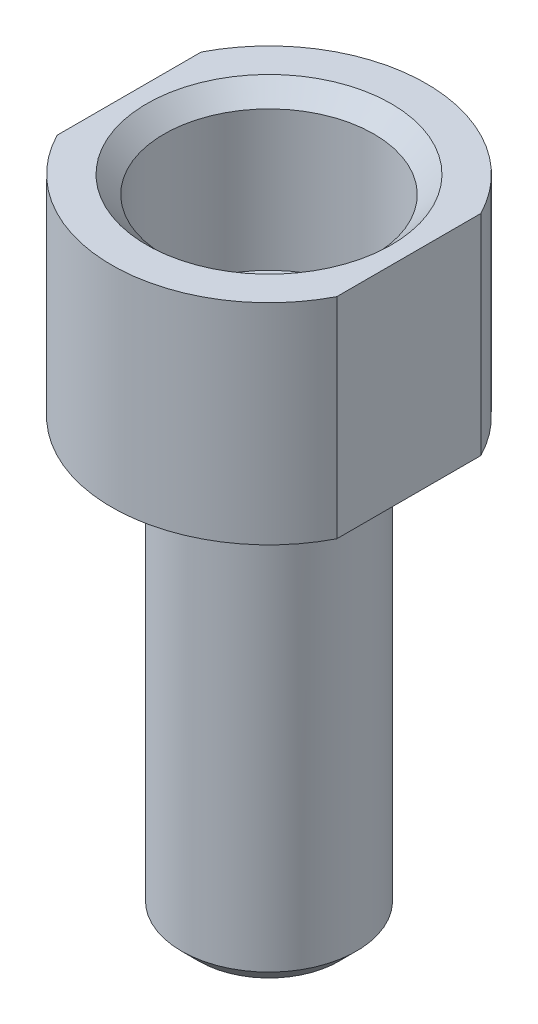
ISO-10303-21;
HEADER;
FILE_DESCRIPTION(('STEP AP214'),'2;1');
FILE_NAME('part.step','',(''),(''),'','','');
FILE_SCHEMA(('AUTOMOTIVE_DESIGN { 1 0 10303 214 1 1 1 1 }'));
ENDSEC;
DATA;
#1=APPLICATION_CONTEXT('core data for automotive mechanical design processes');
#2=APPLICATION_PROTOCOL_DEFINITION('international standard','automotive_design',2000,#1);
#3=PRODUCT_CONTEXT('',#1,'mechanical');
#4=PRODUCT('Part','Part','',(#3));
#5=PRODUCT_RELATED_PRODUCT_CATEGORY('part','',(#4));
#6=PRODUCT_DEFINITION_FORMATION('','',#4);
#7=PRODUCT_DEFINITION_CONTEXT('part definition',#1,'design');
#8=PRODUCT_DEFINITION('design','',#6,#7);
#9=PRODUCT_DEFINITION_SHAPE('','',#8);
#10=(LENGTH_UNIT() NAMED_UNIT(*) SI_UNIT(.MILLI.,.METRE.));
#11=(NAMED_UNIT(*) PLANE_ANGLE_UNIT() SI_UNIT($,.RADIAN.));
#12=(NAMED_UNIT(*) SI_UNIT($,.STERADIAN.) SOLID_ANGLE_UNIT());
#13=UNCERTAINTY_MEASURE_WITH_UNIT(LENGTH_MEASURE(1.E-05),#10,'distance_accuracy_value','');
#14=(GEOMETRIC_REPRESENTATION_CONTEXT(3) GLOBAL_UNCERTAINTY_ASSIGNED_CONTEXT((#13)) GLOBAL_UNIT_ASSIGNED_CONTEXT((#10,
#11,#12)) REPRESENTATION_CONTEXT('',''));
#15=CARTESIAN_POINT('',(0.,0.,0.));
#16=DIRECTION('',(0.,0.,1.));
#17=DIRECTION('',(1.,0.,0.));
#18=AXIS2_PLACEMENT_3D('',#15,#16,#17);
#19=CARTESIAN_POINT('',(0.,0.,0.));
#20=DIRECTION('',(0.,-1.,0.));
#21=DIRECTION('',(0.,0.,-1.));
#22=AXIS2_PLACEMENT_3D('',#19,#20,#21);
#23=CYLINDRICAL_SURFACE('',#22,9.);
#24=CARTESIAN_POINT('',(0.,37.,0.));
#25=DIRECTION('',(0.,-1.,0.));
#26=DIRECTION('',(0.,0.,-1.));
#27=AXIS2_PLACEMENT_3D('',#24,#25,#26);
#28=CIRCLE('',#27,9.);
#29=CARTESIAN_POINT('',(8.,37.,4.12310562561765));
#30=VERTEX_POINT('',#29);
#31=CARTESIAN_POINT('',(-8.,37.,4.12310562561765));
#32=VERTEX_POINT('',#31);
#33=EDGE_CURVE('E109',#30,#32,#28,.T.);
#34=ORIENTED_EDGE('',*,*,#33,.T.);
#35=DIRECTION('',(0.,1.,0.));
#36=VECTOR('',#35,1.);
#37=CARTESIAN_POINT('',(-8.,0.,4.12310562561765));
#38=LINE('',#37,#36);
#39=CARTESIAN_POINT('',(-8.,25.,4.12310562561765));
#40=VERTEX_POINT('',#39);
#41=EDGE_CURVE('E62',#40,#32,#38,.T.);
#42=ORIENTED_EDGE('',*,*,#41,.F.);
#43=CARTESIAN_POINT('',(0.,25.,0.));
#44=DIRECTION('',(0.,-1.,0.));
#45=DIRECTION('',(0.,0.,-1.));
#46=AXIS2_PLACEMENT_3D('',#43,#44,#45);
#47=CIRCLE('',#46,9.);
#48=CARTESIAN_POINT('',(8.,25.,4.12310562561765));
#49=VERTEX_POINT('',#48);
#50=EDGE_CURVE('E122',#49,#40,#47,.T.);
#51=ORIENTED_EDGE('',*,*,#50,.F.);
#52=DIRECTION('',(0.,1.,0.));
#53=VECTOR('',#52,1.);
#54=CARTESIAN_POINT('',(8.,0.,4.12310562561765));
#55=LINE('',#54,#53);
#56=EDGE_CURVE('E309',#49,#30,#55,.T.);
#57=ORIENTED_EDGE('',*,*,#56,.T.);
#58=EDGE_LOOP('',(#34,#42,#51,#57));
#59=FACE_BOUND('',#58,.T.);
#60=ADVANCED_FACE('F45',(#59),#23,.T.);
#61=CARTESIAN_POINT('',(0.,6.,0.));
#62=DIRECTION('',(0.,1.,0.));
#63=DIRECTION('',(0.,0.,1.));
#64=AXIS2_PLACEMENT_3D('',#61,#62,#63);
#65=PLANE('',#64);
#66=CARTESIAN_POINT('',(0.,6.,0.));
#67=DIRECTION('',(0.,1.,0.));
#68=DIRECTION('',(0.,0.,1.));
#69=AXIS2_PLACEMENT_3D('',#66,#67,#68);
#70=CIRCLE('',#69,3.00000000000001);
#71=CARTESIAN_POINT('',(0.,6.,3.00000000000001));
#72=VERTEX_POINT('',#71);
#73=EDGE_CURVE('E171',#72,#72,#70,.T.);
#74=ORIENTED_EDGE('',*,*,#73,.T.);
#75=EDGE_LOOP('',(#74));
#76=FACE_BOUND('',#75,.T.);
#77=CARTESIAN_POINT('',(0.,6.,0.));
#78=DIRECTION('',(0.,-1.,0.));
#79=DIRECTION('',(0.,0.,-1.));
#80=AXIS2_PLACEMENT_3D('',#77,#78,#79);
#81=CIRCLE('',#80,3.3);
#82=CARTESIAN_POINT('',(0.,6.,-3.3));
#83=VERTEX_POINT('',#82);
#84=EDGE_CURVE('E143',#83,#83,#81,.T.);
#85=ORIENTED_EDGE('',*,*,#84,.T.);
#86=EDGE_LOOP('',(#85));
#87=FACE_BOUND('',#86,.T.);
#88=ADVANCED_FACE('F204',(#76,#87),#65,.F.);
#89=CARTESIAN_POINT('',(0.,0.,0.));
#90=DIRECTION('',(0.,-1.,0.));
#91=DIRECTION('',(0.,0.,-1.));
#92=AXIS2_PLACEMENT_3D('',#89,#90,#91);
#93=CYLINDRICAL_SURFACE('',#92,3.3);
#94=CARTESIAN_POINT('',(0.,0.499999999999999,0.));
#95=DIRECTION('',(0.,1.,0.));
#96=DIRECTION('',(0.,0.,1.));
#97=AXIS2_PLACEMENT_3D('',#94,#95,#96);
#98=CIRCLE('',#97,3.3);
#99=CARTESIAN_POINT('',(0.,0.499999999999999,3.3));
#100=VERTEX_POINT('',#99);
#101=EDGE_CURVE('E155',#100,#100,#98,.F.);
#102=ORIENTED_EDGE('',*,*,#101,.T.);
#103=EDGE_LOOP('',(#102));
#104=FACE_BOUND('',#103,.T.);
#105=ORIENTED_EDGE('',*,*,#84,.F.);
#106=EDGE_LOOP('',(#105));
#107=FACE_BOUND('',#106,.T.);
#108=ADVANCED_FACE('F210',(#104,#107),#93,.F.);
#109=CARTESIAN_POINT('',(0.,0.,0.));
#110=DIRECTION('',(0.,1.,0.));
#111=DIRECTION('',(0.,0.,1.));
#112=AXIS2_PLACEMENT_3D('',#109,#110,#111);
#113=PLANE('',#112);
#114=CARTESIAN_POINT('',(0.,0.,0.));
#115=DIRECTION('',(0.,1.,0.));
#116=DIRECTION('',(0.,0.,1.));
#117=AXIS2_PLACEMENT_3D('',#114,#115,#116);
#118=CIRCLE('',#117,4.);
#119=CARTESIAN_POINT('',(0.,0.,4.));
#120=VERTEX_POINT('',#119);
#121=EDGE_CURVE('E55',#120,#120,#118,.F.);
#122=ORIENTED_EDGE('',*,*,#121,.T.);
#123=EDGE_LOOP('',(#122));
#124=FACE_BOUND('',#123,.T.);
#125=CARTESIAN_POINT('',(0.,0.,0.));
#126=DIRECTION('',(0.,1.,0.));
#127=DIRECTION('',(0.,0.,1.));
#128=AXIS2_PLACEMENT_3D('',#125,#126,#127);
#129=CIRCLE('',#128,3.8);
#130=CARTESIAN_POINT('',(0.,0.,3.8));
#131=VERTEX_POINT('',#130);
#132=EDGE_CURVE('E159',#131,#131,#129,.T.);
#133=ORIENTED_EDGE('',*,*,#132,.T.);
#134=EDGE_LOOP('',(#133));
#135=FACE_BOUND('',#134,.T.);
#136=ADVANCED_FACE('F191',(#124,#135),#113,.F.);
#137=CARTESIAN_POINT('',(0.,0.,0.));
#138=DIRECTION('',(0.,-1.,0.));
#139=DIRECTION('',(0.,0.,-1.));
#140=AXIS2_PLACEMENT_3D('',#137,#138,#139);
#141=CYLINDRICAL_SURFACE('',#140,5.);
#142=CARTESIAN_POINT('',(0.,1.,0.));
#143=DIRECTION('',(0.,1.,0.));
#144=DIRECTION('',(0.,0.,1.));
#145=AXIS2_PLACEMENT_3D('',#142,#143,#144);
#146=CIRCLE('',#145,5.);
#147=CARTESIAN_POINT('',(0.,1.,5.));
#148=VERTEX_POINT('',#147);
#149=EDGE_CURVE('E11',#148,#148,#146,.T.);
#150=ORIENTED_EDGE('',*,*,#149,.T.);
#151=EDGE_LOOP('',(#150));
#152=FACE_BOUND('',#151,.T.);
#153=CARTESIAN_POINT('',(0.,25.,0.));
#154=DIRECTION('',(0.,-1.,0.));
#155=DIRECTION('',(0.,0.,-1.));
#156=AXIS2_PLACEMENT_3D('',#153,#154,#155);
#157=CIRCLE('',#156,5.);
#158=CARTESIAN_POINT('',(0.,25.,-5.));
#159=VERTEX_POINT('',#158);
#160=EDGE_CURVE('E139',#159,#159,#157,.T.);
#161=ORIENTED_EDGE('',*,*,#160,.T.);
#162=EDGE_LOOP('',(#161));
#163=FACE_BOUND('',#162,.T.);
#164=ADVANCED_FACE('F244',(#152,#163),#141,.T.);
#165=CARTESIAN_POINT('',(0.,25.,0.));
#166=DIRECTION('',(0.,1.,0.));
#167=DIRECTION('',(0.,0.,1.));
#168=AXIS2_PLACEMENT_3D('',#165,#166,#167);
#169=PLANE('',#168);
#170=ORIENTED_EDGE('',*,*,#160,.F.);
#171=EDGE_LOOP('',(#170));
#172=FACE_BOUND('',#171,.T.);
#173=CARTESIAN_POINT('',(0.,25.,0.));
#174=DIRECTION('',(0.,-1.,0.));
#175=DIRECTION('',(0.,0.,-1.));
#176=AXIS2_PLACEMENT_3D('',#173,#174,#175);
#177=CIRCLE('',#176,5.41);
#178=CARTESIAN_POINT('',(0.,25.,-5.41));
#179=VERTEX_POINT('',#178);
#180=EDGE_CURVE('E135',#179,#179,#177,.T.);
#181=ORIENTED_EDGE('',*,*,#180,.T.);
#182=EDGE_LOOP('',(#181));
#183=FACE_BOUND('',#182,.T.);
#184=ADVANCED_FACE('F240',(#172,#183),#169,.F.);
#185=CARTESIAN_POINT('',(0.,0.,0.));
#186=DIRECTION('',(0.,-1.,0.));
#187=DIRECTION('',(0.,0.,-1.));
#188=AXIS2_PLACEMENT_3D('',#185,#186,#187);
#189=CYLINDRICAL_SURFACE('',#188,5.41);
#190=ORIENTED_EDGE('',*,*,#180,.F.);
#191=EDGE_LOOP('',(#190));
#192=FACE_BOUND('',#191,.T.);
#193=CARTESIAN_POINT('',(0.,26.25,0.));
#194=DIRECTION('',(0.,-1.,0.));
#195=DIRECTION('',(0.,0.,-1.));
#196=AXIS2_PLACEMENT_3D('',#193,#194,#195);
#197=CIRCLE('',#196,5.41);
#198=CARTESIAN_POINT('',(0.,26.25,-5.41));
#199=VERTEX_POINT('',#198);
#200=EDGE_CURVE('E131',#199,#199,#197,.T.);
#201=ORIENTED_EDGE('',*,*,#200,.T.);
#202=EDGE_LOOP('',(#201));
#203=FACE_BOUND('',#202,.T.);
#204=ADVANCED_FACE('F236',(#192,#203),#189,.T.);
#205=CARTESIAN_POINT('',(0.,26.25,0.));
#206=DIRECTION('',(0.,1.,0.));
#207=DIRECTION('',(0.,0.,1.));
#208=AXIS2_PLACEMENT_3D('',#205,#206,#207);
#209=PLANE('',#208);
#210=ORIENTED_EDGE('',*,*,#200,.F.);
#211=EDGE_LOOP('',(#210));
#212=FACE_BOUND('',#211,.T.);
#213=CARTESIAN_POINT('',(0.,26.25,0.));
#214=DIRECTION('',(0.,-1.,0.));
#215=DIRECTION('',(0.,0.,-1.));
#216=AXIS2_PLACEMENT_3D('',#213,#214,#215);
#217=CIRCLE('',#216,7.56);
#218=CARTESIAN_POINT('',(0.,26.25,-7.56));
#219=VERTEX_POINT('',#218);
#220=EDGE_CURVE('E127',#219,#219,#217,.T.);
#221=ORIENTED_EDGE('',*,*,#220,.T.);
#222=EDGE_LOOP('',(#221));
#223=FACE_BOUND('',#222,.T.);
#224=ADVANCED_FACE('F228',(#212,#223),#209,.F.);
#225=CARTESIAN_POINT('',(0.,0.,0.));
#226=DIRECTION('',(0.,-1.,0.));
#227=DIRECTION('',(0.,0.,-1.));
#228=AXIS2_PLACEMENT_3D('',#225,#226,#227);
#229=CYLINDRICAL_SURFACE('',#228,7.56);
#230=ORIENTED_EDGE('',*,*,#220,.F.);
#231=EDGE_LOOP('',(#230));
#232=FACE_BOUND('',#231,.T.);
#233=CARTESIAN_POINT('',(0.,25.,0.));
#234=DIRECTION('',(0.,-1.,0.));
#235=DIRECTION('',(0.,0.,-1.));
#236=AXIS2_PLACEMENT_3D('',#233,#234,#235);
#237=CIRCLE('',#236,7.56);
#238=CARTESIAN_POINT('',(0.,25.,-7.56));
#239=VERTEX_POINT('',#238);
#240=EDGE_CURVE('E123',#239,#239,#237,.T.);
#241=ORIENTED_EDGE('',*,*,#240,.T.);
#242=EDGE_LOOP('',(#241));
#243=FACE_BOUND('',#242,.T.);
#244=ADVANCED_FACE('F223',(#232,#243),#229,.F.);
#245=CARTESIAN_POINT('',(0.,25.,0.));
#246=DIRECTION('',(0.,1.,0.));
#247=DIRECTION('',(0.,0.,1.));
#248=AXIS2_PLACEMENT_3D('',#245,#246,#247);
#249=PLANE('',#248);
#250=ORIENTED_EDGE('',*,*,#240,.F.);
#251=EDGE_LOOP('',(#250));
#252=FACE_BOUND('',#251,.T.);
#253=ORIENTED_EDGE('',*,*,#50,.T.);
#254=DIRECTION('',(0.,0.,-1.));
#255=VECTOR('',#254,1.);
#256=CARTESIAN_POINT('',(-8.,25.,0.));
#257=LINE('',#256,#255);
#258=CARTESIAN_POINT('',(-8.,25.,-4.12310562561765));
#259=VERTEX_POINT('',#258);
#260=EDGE_CURVE('E301',#40,#259,#257,.T.);
#261=ORIENTED_EDGE('',*,*,#260,.T.);
#262=CARTESIAN_POINT('',(8.,25.,-4.12310562561765));
#263=VERTEX_POINT('',#262);
#264=EDGE_CURVE('E103',#259,#263,#47,.T.);
#265=ORIENTED_EDGE('',*,*,#264,.T.);
#266=DIRECTION('',(0.,0.,1.));
#267=VECTOR('',#266,1.);
#268=CARTESIAN_POINT('',(8.,25.,0.));
#269=LINE('',#268,#267);
#270=EDGE_CURVE('E105',#263,#49,#269,.T.);
#271=ORIENTED_EDGE('',*,*,#270,.T.);
#272=EDGE_LOOP('',(#253,#261,#265,#271));
#273=FACE_BOUND('',#272,.T.);
#274=ADVANCED_FACE('F216',(#252,#273),#249,.F.);
#275=ORIENTED_EDGE('',*,*,#264,.F.);
#276=DIRECTION('',(0.,1.,0.));
#277=VECTOR('',#276,1.);
#278=CARTESIAN_POINT('',(-8.,0.,-4.12310562561765));
#279=LINE('',#278,#277);
#280=CARTESIAN_POINT('',(-8.,37.,-4.12310562561765));
#281=VERTEX_POINT('',#280);
#282=EDGE_CURVE('E88',#259,#281,#279,.T.);
#283=ORIENTED_EDGE('',*,*,#282,.T.);
#284=CARTESIAN_POINT('',(8.,37.,-4.12310562561765));
#285=VERTEX_POINT('',#284);
#286=EDGE_CURVE('E101',#281,#285,#28,.T.);
#287=ORIENTED_EDGE('',*,*,#286,.T.);
#288=DIRECTION('',(0.,1.,0.));
#289=VECTOR('',#288,1.);
#290=CARTESIAN_POINT('',(8.,0.,-4.12310562561765));
#291=LINE('',#290,#289);
#292=EDGE_CURVE('E70',#263,#285,#291,.T.);
#293=ORIENTED_EDGE('',*,*,#292,.F.);
#294=EDGE_LOOP('',(#275,#283,#287,#293));
#295=FACE_BOUND('',#294,.T.);
#296=ADVANCED_FACE('F100',(#295),#23,.T.);
#297=CARTESIAN_POINT('',(0.,37.,0.));
#298=DIRECTION('',(0.,-1.,0.));
#299=DIRECTION('',(0.,0.,-1.));
#300=AXIS2_PLACEMENT_3D('',#297,#298,#299);
#301=PLANE('',#300);
#302=CARTESIAN_POINT('',(0.,37.,0.));
#303=DIRECTION('',(0.,-1.,0.));
#304=DIRECTION('',(0.,0.,-1.));
#305=AXIS2_PLACEMENT_3D('',#302,#303,#304);
#306=CIRCLE('',#305,7.);
#307=CARTESIAN_POINT('',(0.,37.,-7.));
#308=VERTEX_POINT('',#307);
#309=EDGE_CURVE('E147',#308,#308,#306,.T.);
#310=ORIENTED_EDGE('',*,*,#309,.T.);
#311=EDGE_LOOP('',(#310));
#312=FACE_BOUND('',#311,.T.);
#313=ORIENTED_EDGE('',*,*,#286,.F.);
#314=DIRECTION('',(0.,0.,-1.));
#315=VECTOR('',#314,1.);
#316=CARTESIAN_POINT('',(-8.,37.,-4.12310562561765));
#317=LINE('',#316,#315);
#318=EDGE_CURVE('E85',#32,#281,#317,.T.);
#319=ORIENTED_EDGE('',*,*,#318,.F.);
#320=ORIENTED_EDGE('',*,*,#33,.F.);
#321=DIRECTION('',(0.,0.,1.));
#322=VECTOR('',#321,1.);
#323=CARTESIAN_POINT('',(8.,37.,-4.12310562561765));
#324=LINE('',#323,#322);
#325=EDGE_CURVE('E95',#285,#30,#324,.T.);
#326=ORIENTED_EDGE('',*,*,#325,.F.);
#327=EDGE_LOOP('',(#313,#319,#320,#326));
#328=FACE_BOUND('',#327,.T.);
#329=ADVANCED_FACE('F107',(#312,#328),#301,.F.);
#330=CARTESIAN_POINT('',(0.,0.,0.));
#331=DIRECTION('',(0.,-1.,0.));
#332=DIRECTION('',(0.,0.,-1.));
#333=AXIS2_PLACEMENT_3D('',#330,#331,#332);
#334=CYLINDRICAL_SURFACE('',#333,6.);
#335=CARTESIAN_POINT('',(0.,36.,0.));
#336=DIRECTION('',(0.,-1.,0.));
#337=DIRECTION('',(0.,0.,-1.));
#338=AXIS2_PLACEMENT_3D('',#335,#336,#337);
#339=CIRCLE('',#338,6.);
#340=CARTESIAN_POINT('',(0.,36.,-6.));
#341=VERTEX_POINT('',#340);
#342=EDGE_CURVE('E151',#341,#341,#339,.F.);
#343=ORIENTED_EDGE('',*,*,#342,.T.);
#344=EDGE_LOOP('',(#343));
#345=FACE_BOUND('',#344,.T.);
#346=CARTESIAN_POINT('',(0.,28.,0.));
#347=DIRECTION('',(0.,-1.,0.));
#348=DIRECTION('',(0.,0.,-1.));
#349=AXIS2_PLACEMENT_3D('',#346,#347,#348);
#350=CIRCLE('',#349,6.);
#351=CARTESIAN_POINT('',(0.,28.,-6.));
#352=VERTEX_POINT('',#351);
#353=EDGE_CURVE('E110',#352,#352,#350,.T.);
#354=ORIENTED_EDGE('',*,*,#353,.T.);
#355=EDGE_LOOP('',(#354));
#356=FACE_BOUND('',#355,.T.);
#357=ADVANCED_FACE('F221',(#345,#356),#334,.F.);
#358=CARTESIAN_POINT('',(0.,28.,0.));
#359=DIRECTION('',(0.,-1.,0.));
#360=DIRECTION('',(0.,0.,-1.));
#361=AXIS2_PLACEMENT_3D('',#358,#359,#360);
#362=PLANE('',#361);
#363=CARTESIAN_POINT('',(0.,28.,0.));
#364=DIRECTION('',(0.,-1.,0.));
#365=DIRECTION('',(0.,0.,-1.));
#366=AXIS2_PLACEMENT_3D('',#363,#364,#365);
#367=CIRCLE('',#366,3.8);
#368=CARTESIAN_POINT('',(0.,28.,-3.8));
#369=VERTEX_POINT('',#368);
#370=EDGE_CURVE('E179',#369,#369,#367,.T.);
#371=ORIENTED_EDGE('',*,*,#370,.T.);
#372=EDGE_LOOP('',(#371));
#373=FACE_BOUND('',#372,.T.);
#374=ORIENTED_EDGE('',*,*,#353,.F.);
#375=EDGE_LOOP('',(#374));
#376=FACE_BOUND('',#375,.T.);
#377=ADVANCED_FACE('F331',(#373,#376),#362,.F.);
#378=CARTESIAN_POINT('',(0.,0.,0.));
#379=DIRECTION('',(0.,-1.,0.));
#380=DIRECTION('',(0.,0.,-1.));
#381=AXIS2_PLACEMENT_3D('',#378,#379,#380);
#382=CYLINDRICAL_SURFACE('',#381,3.3);
#383=CARTESIAN_POINT('',(0.,27.5,0.));
#384=DIRECTION('',(0.,-1.,0.));
#385=DIRECTION('',(0.,0.,-1.));
#386=AXIS2_PLACEMENT_3D('',#383,#384,#385);
#387=CIRCLE('',#386,3.3);
#388=CARTESIAN_POINT('',(0.,27.5,-3.3));
#389=VERTEX_POINT('',#388);
#390=EDGE_CURVE('E183',#389,#389,#387,.F.);
#391=ORIENTED_EDGE('',*,*,#390,.T.);
#392=EDGE_LOOP('',(#391));
#393=FACE_BOUND('',#392,.T.);
#394=CARTESIAN_POINT('',(0.,22.,0.));
#395=DIRECTION('',(0.,-1.,0.));
#396=DIRECTION('',(0.,0.,-1.));
#397=AXIS2_PLACEMENT_3D('',#394,#395,#396);
#398=CIRCLE('',#397,3.3);
#399=CARTESIAN_POINT('',(0.,22.,-3.3));
#400=VERTEX_POINT('',#399);
#401=EDGE_CURVE('E116',#400,#400,#398,.T.);
#402=ORIENTED_EDGE('',*,*,#401,.T.);
#403=EDGE_LOOP('',(#402));
#404=FACE_BOUND('',#403,.T.);
#405=ADVANCED_FACE('F295',(#393,#404),#382,.F.);
#406=CARTESIAN_POINT('',(0.,22.,0.));
#407=DIRECTION('',(0.,-1.,0.));
#408=DIRECTION('',(0.,0.,-1.));
#409=AXIS2_PLACEMENT_3D('',#406,#407,#408);
#410=PLANE('',#409);
#411=CARTESIAN_POINT('',(0.,22.,0.));
#412=DIRECTION('',(0.,-1.,0.));
#413=DIRECTION('',(0.,0.,-1.));
#414=AXIS2_PLACEMENT_3D('',#411,#412,#413);
#415=CIRCLE('',#414,3.00000000000001);
#416=CARTESIAN_POINT('',(0.,22.,-3.00000000000001));
#417=VERTEX_POINT('',#416);
#418=EDGE_CURVE('E175',#417,#417,#415,.T.);
#419=ORIENTED_EDGE('',*,*,#418,.T.);
#420=EDGE_LOOP('',(#419));
#421=FACE_BOUND('',#420,.T.);
#422=ORIENTED_EDGE('',*,*,#401,.F.);
#423=EDGE_LOOP('',(#422));
#424=FACE_BOUND('',#423,.T.);
#425=ADVANCED_FACE('F291',(#421,#424),#410,.F.);
#426=CARTESIAN_POINT('',(0.,0.,0.));
#427=DIRECTION('',(0.,-1.,0.));
#428=DIRECTION('',(0.,0.,-1.));
#429=AXIS2_PLACEMENT_3D('',#426,#427,#428);
#430=CYLINDRICAL_SURFACE('',#429,2.5);
#431=CARTESIAN_POINT('',(0.,6.5,0.));
#432=DIRECTION('',(0.,1.,0.));
#433=DIRECTION('',(0.,0.,1.));
#434=AXIS2_PLACEMENT_3D('',#431,#432,#433);
#435=CIRCLE('',#434,2.5);
#436=CARTESIAN_POINT('',(0.,6.5,2.5));
#437=VERTEX_POINT('',#436);
#438=EDGE_CURVE('E167',#437,#437,#435,.F.);
#439=ORIENTED_EDGE('',*,*,#438,.T.);
#440=EDGE_LOOP('',(#439));
#441=FACE_BOUND('',#440,.T.);
#442=CARTESIAN_POINT('',(0.,21.5,0.));
#443=DIRECTION('',(0.,-1.,0.));
#444=DIRECTION('',(0.,0.,-1.));
#445=AXIS2_PLACEMENT_3D('',#442,#443,#444);
#446=CIRCLE('',#445,2.5);
#447=CARTESIAN_POINT('',(0.,21.5,-2.5));
#448=VERTEX_POINT('',#447);
#449=EDGE_CURVE('E163',#448,#448,#446,.F.);
#450=ORIENTED_EDGE('',*,*,#449,.T.);
#451=EDGE_LOOP('',(#450));
#452=FACE_BOUND('',#451,.T.);
#453=ADVANCED_FACE('F294',(#441,#452),#430,.F.);
#454=CARTESIAN_POINT('',(8.,0.,-4.12310562561765));
#455=DIRECTION('',(-1.,0.,0.));
#456=DIRECTION('',(0.,0.,1.));
#457=AXIS2_PLACEMENT_3D('',#454,#455,#456);
#458=PLANE('',#457);
#459=ORIENTED_EDGE('',*,*,#292,.T.);
#460=ORIENTED_EDGE('',*,*,#325,.T.);
#461=ORIENTED_EDGE('',*,*,#56,.F.);
#462=ORIENTED_EDGE('',*,*,#270,.F.);
#463=EDGE_LOOP('',(#459,#460,#461,#462));
#464=FACE_BOUND('',#463,.T.);
#465=ADVANCED_FACE('F318',(#464),#458,.F.);
#466=CARTESIAN_POINT('',(-8.,0.,-4.12310562561765));
#467=DIRECTION('',(1.,0.,0.));
#468=DIRECTION('',(0.,0.,-1.));
#469=AXIS2_PLACEMENT_3D('',#466,#467,#468);
#470=PLANE('',#469);
#471=ORIENTED_EDGE('',*,*,#41,.T.);
#472=ORIENTED_EDGE('',*,*,#318,.T.);
#473=ORIENTED_EDGE('',*,*,#282,.F.);
#474=ORIENTED_EDGE('',*,*,#260,.F.);
#475=EDGE_LOOP('',(#471,#472,#473,#474));
#476=FACE_BOUND('',#475,.T.);
#477=ADVANCED_FACE('F87',(#476),#470,.F.);
#478=CARTESIAN_POINT('',(0.,37.,0.));
#479=DIRECTION('',(0.,1.,0.));
#480=DIRECTION('',(0.,0.,1.));
#481=AXIS2_PLACEMENT_3D('',#478,#479,#480);
#482=CONICAL_SURFACE('',#481,7.,0.785398163397447);
#483=ORIENTED_EDGE('',*,*,#342,.F.);
#484=EDGE_LOOP('',(#483));
#485=FACE_BOUND('',#484,.T.);
#486=ORIENTED_EDGE('',*,*,#309,.F.);
#487=EDGE_LOOP('',(#486));
#488=FACE_BOUND('',#487,.T.);
#489=ADVANCED_FACE('F255',(#485,#488),#482,.F.);
#490=CARTESIAN_POINT('',(0.,0.499999999999999,0.));
#491=DIRECTION('',(0.,-1.,0.));
#492=DIRECTION('',(0.,0.,-1.));
#493=AXIS2_PLACEMENT_3D('',#490,#491,#492);
#494=CONICAL_SURFACE('',#493,3.3,0.785398163397447);
#495=ORIENTED_EDGE('',*,*,#132,.F.);
#496=EDGE_LOOP('',(#495));
#497=FACE_BOUND('',#496,.T.);
#498=ORIENTED_EDGE('',*,*,#101,.F.);
#499=EDGE_LOOP('',(#498));
#500=FACE_BOUND('',#499,.T.);
#501=ADVANCED_FACE('F261',(#497,#500),#494,.F.);
#502=CARTESIAN_POINT('',(0.,6.5,0.));
#503=DIRECTION('',(0.,-1.,0.));
#504=DIRECTION('',(0.,0.,-1.));
#505=AXIS2_PLACEMENT_3D('',#502,#503,#504);
#506=CONICAL_SURFACE('',#505,2.5,0.78539816339745);
#507=ORIENTED_EDGE('',*,*,#73,.F.);
#508=EDGE_LOOP('',(#507));
#509=FACE_BOUND('',#508,.T.);
#510=ORIENTED_EDGE('',*,*,#438,.F.);
#511=EDGE_LOOP('',(#510));
#512=FACE_BOUND('',#511,.T.);
#513=ADVANCED_FACE('F268',(#509,#512),#506,.F.);
#514=CARTESIAN_POINT('',(0.,22.,0.));
#515=DIRECTION('',(0.,1.,0.));
#516=DIRECTION('',(0.,0.,1.));
#517=AXIS2_PLACEMENT_3D('',#514,#515,#516);
#518=CONICAL_SURFACE('',#517,3.00000000000001,0.785398163397443);
#519=ORIENTED_EDGE('',*,*,#449,.F.);
#520=EDGE_LOOP('',(#519));
#521=FACE_BOUND('',#520,.T.);
#522=ORIENTED_EDGE('',*,*,#418,.F.);
#523=EDGE_LOOP('',(#522));
#524=FACE_BOUND('',#523,.T.);
#525=ADVANCED_FACE('F200',(#521,#524),#518,.F.);
#526=CARTESIAN_POINT('',(0.,28.,0.));
#527=DIRECTION('',(0.,1.,0.));
#528=DIRECTION('',(0.,0.,1.));
#529=AXIS2_PLACEMENT_3D('',#526,#527,#528);
#530=CONICAL_SURFACE('',#529,3.8,0.785398163397445);
#531=ORIENTED_EDGE('',*,*,#390,.F.);
#532=EDGE_LOOP('',(#531));
#533=FACE_BOUND('',#532,.T.);
#534=ORIENTED_EDGE('',*,*,#370,.F.);
#535=EDGE_LOOP('',(#534));
#536=FACE_BOUND('',#535,.T.);
#537=ADVANCED_FACE('F195',(#533,#536),#530,.F.);
#538=CARTESIAN_POINT('',(0.,0.,0.));
#539=DIRECTION('',(0.,1.,0.));
#540=DIRECTION('',(0.,0.,1.));
#541=AXIS2_PLACEMENT_3D('',#538,#539,#540);
#542=CONICAL_SURFACE('',#541,4.,0.785398163397447);
#543=ORIENTED_EDGE('',*,*,#149,.F.);
#544=EDGE_LOOP('',(#543));
#545=FACE_BOUND('',#544,.T.);
#546=ORIENTED_EDGE('',*,*,#121,.F.);
#547=EDGE_LOOP('',(#546));
#548=FACE_BOUND('',#547,.T.);
#549=ADVANCED_FACE('F48',(#545,#548),#542,.T.);
#550=CLOSED_SHELL('',(#60,#88,#108,#136,#164,#184,#204,#224,#244,#274,#296,#329,#357,#377,#405,
#425,#453,#465,#477,#489,#501,#513,#525,#537,#549));
#551=MANIFOLD_SOLID_BREP('B2',#550);
#552=ADVANCED_BREP_SHAPE_REPRESENTATION('',(#18,#551),#14);
#553=SHAPE_DEFINITION_REPRESENTATION(#9,#552);
ENDSEC;
END-ISO-10303-21;
